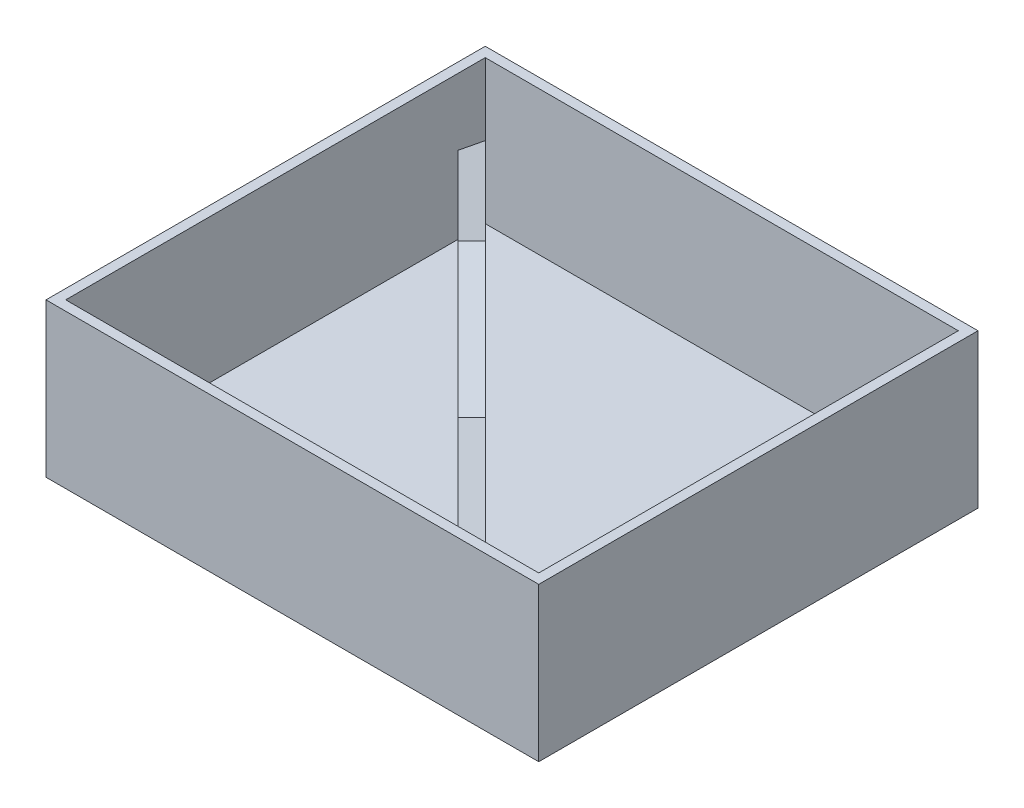
ISO-10303-21;
HEADER;
FILE_DESCRIPTION(('STEP AP214'),'2;1');
FILE_NAME('part.step','',(''),(''),'','','');
FILE_SCHEMA(('AUTOMOTIVE_DESIGN { 1 0 10303 214 1 1 1 1 }'));
ENDSEC;
DATA;
#1=APPLICATION_CONTEXT('core data for automotive mechanical design processes');
#2=APPLICATION_PROTOCOL_DEFINITION('international standard','automotive_design',2000,#1);
#3=PRODUCT_CONTEXT('',#1,'mechanical');
#4=PRODUCT('Part','Part','',(#3));
#5=PRODUCT_RELATED_PRODUCT_CATEGORY('part','',(#4));
#6=PRODUCT_DEFINITION_FORMATION('','',#4);
#7=PRODUCT_DEFINITION_CONTEXT('part definition',#1,'design');
#8=PRODUCT_DEFINITION('design','',#6,#7);
#9=PRODUCT_DEFINITION_SHAPE('','',#8);
#10=(LENGTH_UNIT() NAMED_UNIT(*) SI_UNIT(.MILLI.,.METRE.));
#11=(NAMED_UNIT(*) PLANE_ANGLE_UNIT() SI_UNIT($,.RADIAN.));
#12=(NAMED_UNIT(*) SI_UNIT($,.STERADIAN.) SOLID_ANGLE_UNIT());
#13=UNCERTAINTY_MEASURE_WITH_UNIT(LENGTH_MEASURE(1.E-05),#10,'distance_accuracy_value','');
#14=(GEOMETRIC_REPRESENTATION_CONTEXT(3) GLOBAL_UNCERTAINTY_ASSIGNED_CONTEXT((#13)) GLOBAL_UNIT_ASSIGNED_CONTEXT((#10,
#11,#12)) REPRESENTATION_CONTEXT('',''));
#15=CARTESIAN_POINT('',(0.,0.,0.));
#16=DIRECTION('',(0.,0.,1.));
#17=DIRECTION('',(1.,0.,0.));
#18=AXIS2_PLACEMENT_3D('',#15,#16,#17);
#19=CARTESIAN_POINT('',(0.,2.54,0.));
#20=DIRECTION('',(0.,1.,0.));
#21=DIRECTION('',(0.,0.,1.));
#22=AXIS2_PLACEMENT_3D('',#19,#20,#21);
#23=PLANE('',#22);
#24=DIRECTION('',(-1.,0.,0.));
#25=VECTOR('',#24,1.);
#26=CARTESIAN_POINT('',(-62.4778997860176,2.54,-61.397043942379));
#27=LINE('',#26,#25);
#28=CARTESIAN_POINT('',(62.0602912861796,2.54,-61.397043942379));
#29=VERTEX_POINT('',#28);
#30=CARTESIAN_POINT('',(-59.9378997860176,2.54,-61.3970439423789));
#31=VERTEX_POINT('',#30);
#32=EDGE_CURVE('E203',#29,#31,#27,.T.);
#33=ORIENTED_EDGE('',*,*,#32,.T.);
#34=DIRECTION('',(0.707106781186548,0.,0.707106781186547));
#35=VECTOR('',#34,1.);
#36=CARTESIAN_POINT('',(0.729572078180674,2.54,-0.729572078180674));
#37=LINE('',#36,#35);
#38=CARTESIAN_POINT('',(48.2647465351268,2.54,46.8056023787655));
#39=VERTEX_POINT('',#38);
#40=EDGE_CURVE('E245',#31,#39,#37,.T.);
#41=ORIENTED_EDGE('',*,*,#40,.T.);
#42=DIRECTION('',(1.,0.,0.));
#43=VECTOR('',#42,1.);
#44=CARTESIAN_POINT('',(-62.4778997860176,2.54,46.8056023787655));
#45=LINE('',#44,#43);
#46=CARTESIAN_POINT('',(62.0602912861796,2.54,46.8056023787655));
#47=VERTEX_POINT('',#46);
#48=EDGE_CURVE('E187',#39,#47,#45,.T.);
#49=ORIENTED_EDGE('',*,*,#48,.T.);
#50=DIRECTION('',(0.,0.,-1.));
#51=VECTOR('',#50,1.);
#52=CARTESIAN_POINT('',(62.0602912861796,2.54,-63.9370439423789));
#53=LINE('',#52,#51);
#54=EDGE_CURVE('E198',#47,#29,#53,.T.);
#55=ORIENTED_EDGE('',*,*,#54,.T.);
#56=EDGE_LOOP('',(#33,#41,#49,#55));
#57=FACE_BOUND('',#56,.T.);
#58=ADVANCED_FACE('F43',(#57),#23,.T.);
#59=CARTESIAN_POINT('',(-62.4778997860176,39.624,-63.9370439423789));
#60=DIRECTION('',(1.,0.,0.));
#61=DIRECTION('',(0.,0.,-1.));
#62=AXIS2_PLACEMENT_3D('',#59,#60,#61);
#63=PLANE('',#62);
#64=DIRECTION('',(0.,-1.,0.));
#65=VECTOR('',#64,1.);
#66=CARTESIAN_POINT('',(-62.4778997860176,39.624,-63.9370439423789));
#67=LINE('',#66,#65);
#68=CARTESIAN_POINT('',(-62.4778997860176,39.624,-63.9370439423789));
#69=VERTEX_POINT('',#68);
#70=CARTESIAN_POINT('',(-62.4778997860176,0.,-63.9370439423789));
#71=VERTEX_POINT('',#70);
#72=EDGE_CURVE('E222',#69,#71,#67,.T.);
#73=ORIENTED_EDGE('',*,*,#72,.T.);
#74=DIRECTION('',(0.,0.,1.));
#75=VECTOR('',#74,1.);
#76=CARTESIAN_POINT('',(-62.4778997860176,0.,-63.9370439423789));
#77=LINE('',#76,#75);
#78=CARTESIAN_POINT('',(-62.4778997860176,0.,49.3456023787655));
#79=VERTEX_POINT('',#78);
#80=EDGE_CURVE('E188',#71,#79,#77,.T.);
#81=ORIENTED_EDGE('',*,*,#80,.T.);
#82=DIRECTION('',(0.,-1.,0.));
#83=VECTOR('',#82,1.);
#84=CARTESIAN_POINT('',(-62.4778997860176,39.624,49.3456023787655));
#85=LINE('',#84,#83);
#86=CARTESIAN_POINT('',(-62.4778997860176,39.624,49.3456023787655));
#87=VERTEX_POINT('',#86);
#88=EDGE_CURVE('E237',#87,#79,#85,.T.);
#89=ORIENTED_EDGE('',*,*,#88,.F.);
#90=DIRECTION('',(0.,0.,1.));
#91=VECTOR('',#90,1.);
#92=CARTESIAN_POINT('',(-62.4778997860176,39.624,-63.9370439423789));
#93=LINE('',#92,#91);
#94=EDGE_CURVE('E211',#69,#87,#93,.T.);
#95=ORIENTED_EDGE('',*,*,#94,.F.);
#96=EDGE_LOOP('',(#73,#81,#89,#95));
#97=FACE_BOUND('',#96,.T.);
#98=ADVANCED_FACE('F44',(#97),#63,.F.);
#99=CARTESIAN_POINT('',(-62.4778997860176,39.624,49.3456023787655));
#100=DIRECTION('',(0.,0.,-1.));
#101=DIRECTION('',(-1.,0.,0.));
#102=AXIS2_PLACEMENT_3D('',#99,#100,#101);
#103=PLANE('',#102);
#104=DIRECTION('',(1.,0.,0.));
#105=VECTOR('',#104,1.);
#106=CARTESIAN_POINT('',(-62.4778997860176,0.,49.3456023787655));
#107=LINE('',#106,#105);
#108=CARTESIAN_POINT('',(64.6002912861796,0.,49.3456023787655));
#109=VERTEX_POINT('',#108);
#110=EDGE_CURVE('E228',#79,#109,#107,.T.);
#111=ORIENTED_EDGE('',*,*,#110,.T.);
#112=DIRECTION('',(0.,-1.,0.));
#113=VECTOR('',#112,1.);
#114=CARTESIAN_POINT('',(64.6002912861796,39.624,49.3456023787655));
#115=LINE('',#114,#113);
#116=CARTESIAN_POINT('',(64.6002912861796,39.624,49.3456023787655));
#117=VERTEX_POINT('',#116);
#118=EDGE_CURVE('E236',#117,#109,#115,.T.);
#119=ORIENTED_EDGE('',*,*,#118,.F.);
#120=DIRECTION('',(1.,0.,0.));
#121=VECTOR('',#120,1.);
#122=CARTESIAN_POINT('',(-62.4778997860176,39.624,49.3456023787655));
#123=LINE('',#122,#121);
#124=EDGE_CURVE('E217',#87,#117,#123,.T.);
#125=ORIENTED_EDGE('',*,*,#124,.F.);
#126=ORIENTED_EDGE('',*,*,#88,.T.);
#127=EDGE_LOOP('',(#111,#119,#125,#126));
#128=FACE_BOUND('',#127,.T.);
#129=ADVANCED_FACE('F285',(#128),#103,.F.);
#130=CARTESIAN_POINT('',(64.6002912861796,39.624,-63.9370439423789));
#131=DIRECTION('',(-1.,0.,0.));
#132=DIRECTION('',(0.,0.,1.));
#133=AXIS2_PLACEMENT_3D('',#130,#131,#132);
#134=PLANE('',#133);
#135=DIRECTION('',(0.,0.,-1.));
#136=VECTOR('',#135,1.);
#137=CARTESIAN_POINT('',(64.6002912861796,0.,-63.9370439423789));
#138=LINE('',#137,#136);
#139=CARTESIAN_POINT('',(64.6002912861796,0.,-63.9370439423789));
#140=VERTEX_POINT('',#139);
#141=EDGE_CURVE('E226',#109,#140,#138,.T.);
#142=ORIENTED_EDGE('',*,*,#141,.T.);
#143=DIRECTION('',(0.,-1.,0.));
#144=VECTOR('',#143,1.);
#145=CARTESIAN_POINT('',(64.6002912861796,39.624,-63.9370439423789));
#146=LINE('',#145,#144);
#147=CARTESIAN_POINT('',(64.6002912861796,39.624,-63.9370439423789));
#148=VERTEX_POINT('',#147);
#149=EDGE_CURVE('E231',#148,#140,#146,.T.);
#150=ORIENTED_EDGE('',*,*,#149,.F.);
#151=DIRECTION('',(0.,0.,-1.));
#152=VECTOR('',#151,1.);
#153=CARTESIAN_POINT('',(64.6002912861796,39.624,-63.9370439423789));
#154=LINE('',#153,#152);
#155=EDGE_CURVE('E220',#117,#148,#154,.T.);
#156=ORIENTED_EDGE('',*,*,#155,.F.);
#157=ORIENTED_EDGE('',*,*,#118,.T.);
#158=EDGE_LOOP('',(#142,#150,#156,#157));
#159=FACE_BOUND('',#158,.T.);
#160=ADVANCED_FACE('F300',(#159),#134,.F.);
#161=CARTESIAN_POINT('',(-62.4778997860176,39.624,-63.9370439423789));
#162=DIRECTION('',(0.,0.,1.));
#163=DIRECTION('',(1.,0.,0.));
#164=AXIS2_PLACEMENT_3D('',#161,#162,#163);
#165=PLANE('',#164);
#166=DIRECTION('',(-1.,0.,0.));
#167=VECTOR('',#166,1.);
#168=CARTESIAN_POINT('',(-62.4778997860176,0.,-63.9370439423789));
#169=LINE('',#168,#167);
#170=EDGE_CURVE('E219',#140,#71,#169,.T.);
#171=ORIENTED_EDGE('',*,*,#170,.T.);
#172=ORIENTED_EDGE('',*,*,#72,.F.);
#173=DIRECTION('',(-1.,0.,0.));
#174=VECTOR('',#173,1.);
#175=CARTESIAN_POINT('',(-62.4778997860176,39.624,-63.9370439423789));
#176=LINE('',#175,#174);
#177=EDGE_CURVE('E225',#148,#69,#176,.T.);
#178=ORIENTED_EDGE('',*,*,#177,.F.);
#179=ORIENTED_EDGE('',*,*,#149,.T.);
#180=EDGE_LOOP('',(#171,#172,#178,#179));
#181=FACE_BOUND('',#180,.T.);
#182=ADVANCED_FACE('F293',(#181),#165,.F.);
#183=CARTESIAN_POINT('',(0.,39.624,0.));
#184=DIRECTION('',(0.,1.,0.));
#185=DIRECTION('',(0.,0.,1.));
#186=AXIS2_PLACEMENT_3D('',#183,#184,#185);
#187=PLANE('',#186);
#188=DIRECTION('',(0.,0.,1.));
#189=VECTOR('',#188,1.);
#190=CARTESIAN_POINT('',(-59.9378997860176,39.624,-63.9370439423789));
#191=LINE('',#190,#189);
#192=CARTESIAN_POINT('',(-59.9378997860176,39.624,-61.397043942379));
#193=VERTEX_POINT('',#192);
#194=CARTESIAN_POINT('',(-59.9378997860176,39.624,46.8056023787655));
#195=VERTEX_POINT('',#194);
#196=EDGE_CURVE('E210',#193,#195,#191,.T.);
#197=ORIENTED_EDGE('',*,*,#196,.F.);
#198=DIRECTION('',(-1.,0.,0.));
#199=VECTOR('',#198,1.);
#200=CARTESIAN_POINT('',(-62.4778997860176,39.624,-61.397043942379));
#201=LINE('',#200,#199);
#202=CARTESIAN_POINT('',(62.0602912861796,39.624,-61.397043942379));
#203=VERTEX_POINT('',#202);
#204=EDGE_CURVE('E193',#203,#193,#201,.T.);
#205=ORIENTED_EDGE('',*,*,#204,.F.);
#206=DIRECTION('',(0.,0.,-1.));
#207=VECTOR('',#206,1.);
#208=CARTESIAN_POINT('',(62.0602912861796,39.624,-63.9370439423789));
#209=LINE('',#208,#207);
#210=CARTESIAN_POINT('',(62.0602912861796,39.624,46.8056023787655));
#211=VERTEX_POINT('',#210);
#212=EDGE_CURVE('E212',#211,#203,#209,.T.);
#213=ORIENTED_EDGE('',*,*,#212,.F.);
#214=DIRECTION('',(1.,0.,0.));
#215=VECTOR('',#214,1.);
#216=CARTESIAN_POINT('',(-62.4778997860176,39.624,46.8056023787655));
#217=LINE('',#216,#215);
#218=EDGE_CURVE('E209',#195,#211,#217,.T.);
#219=ORIENTED_EDGE('',*,*,#218,.F.);
#220=EDGE_LOOP('',(#197,#205,#213,#219));
#221=FACE_BOUND('',#220,.T.);
#222=ORIENTED_EDGE('',*,*,#94,.T.);
#223=ORIENTED_EDGE('',*,*,#124,.T.);
#224=ORIENTED_EDGE('',*,*,#155,.T.);
#225=ORIENTED_EDGE('',*,*,#177,.T.);
#226=EDGE_LOOP('',(#222,#223,#224,#225));
#227=FACE_BOUND('',#226,.T.);
#228=ADVANCED_FACE('F261',(#221,#227),#187,.T.);
#229=CARTESIAN_POINT('',(0.,0.,0.));
#230=DIRECTION('',(0.,1.,0.));
#231=DIRECTION('',(0.,0.,1.));
#232=AXIS2_PLACEMENT_3D('',#229,#230,#231);
#233=PLANE('',#232);
#234=ORIENTED_EDGE('',*,*,#110,.F.);
#235=ORIENTED_EDGE('',*,*,#80,.F.);
#236=ORIENTED_EDGE('',*,*,#170,.F.);
#237=ORIENTED_EDGE('',*,*,#141,.F.);
#238=EDGE_LOOP('',(#234,#235,#236,#237));
#239=FACE_BOUND('',#238,.T.);
#240=ADVANCED_FACE('F289',(#239),#233,.F.);
#241=CARTESIAN_POINT('',(-59.9378997860176,39.624,-63.9370439423789));
#242=DIRECTION('',(1.,0.,0.));
#243=DIRECTION('',(0.,0.,-1.));
#244=AXIS2_PLACEMENT_3D('',#241,#242,#243);
#245=PLANE('',#244);
#246=DIRECTION('',(0.,-0.189206076258095,-0.981937401623452));
#247=VECTOR('',#246,1.);
#248=CARTESIAN_POINT('',(-59.9378997860176,21.2739437474469,-60.4012359194636));
#249=LINE('',#248,#247);
#250=CARTESIAN_POINT('',(-59.9378997860176,21.0820649897881,-61.397043942379));
#251=VERTEX_POINT('',#250);
#252=CARTESIAN_POINT('',(-59.9378997860176,22.4445642625789,-54.3259761305135));
#253=VERTEX_POINT('',#252);
#254=EDGE_CURVE('E146',#251,#253,#249,.F.);
#255=ORIENTED_EDGE('',*,*,#254,.F.);
#256=DIRECTION('',(0.,-1.,0.));
#257=VECTOR('',#256,1.);
#258=CARTESIAN_POINT('',(-59.9378997860176,39.624,-61.397043942379));
#259=LINE('',#258,#257);
#260=EDGE_CURVE('E195',#193,#251,#259,.T.);
#261=ORIENTED_EDGE('',*,*,#260,.F.);
#262=ORIENTED_EDGE('',*,*,#196,.T.);
#263=DIRECTION('',(0.,-1.,0.));
#264=VECTOR('',#263,1.);
#265=CARTESIAN_POINT('',(-59.9378997860176,39.624,46.8056023787655));
#266=LINE('',#265,#264);
#267=CARTESIAN_POINT('',(-59.9378997860176,2.54,46.8056023787655));
#268=VERTEX_POINT('',#267);
#269=EDGE_CURVE('E190',#195,#268,#266,.T.);
#270=ORIENTED_EDGE('',*,*,#269,.T.);
#271=DIRECTION('',(0.,0.,1.));
#272=VECTOR('',#271,1.);
#273=CARTESIAN_POINT('',(-59.9378997860176,2.54,-63.9370439423789));
#274=LINE('',#273,#272);
#275=CARTESIAN_POINT('',(-59.9378997860176,2.54,-54.3259761305135));
#276=VERTEX_POINT('',#275);
#277=EDGE_CURVE('E183',#276,#268,#274,.T.);
#278=ORIENTED_EDGE('',*,*,#277,.F.);
#279=DIRECTION('',(0.,-1.,0.));
#280=VECTOR('',#279,1.);
#281=CARTESIAN_POINT('',(-59.9378997860176,39.624,-54.3259761305135));
#282=LINE('',#281,#280);
#283=EDGE_CURVE('E181',#253,#276,#282,.T.);
#284=ORIENTED_EDGE('',*,*,#283,.F.);
#285=EDGE_LOOP('',(#255,#261,#262,#270,#278,#284));
#286=FACE_BOUND('',#285,.T.);
#287=ADVANCED_FACE('F251',(#286),#245,.T.);
#288=CARTESIAN_POINT('',(-62.4778997860176,39.624,46.8056023787655));
#289=DIRECTION('',(0.,0.,-1.));
#290=DIRECTION('',(-1.,0.,0.));
#291=AXIS2_PLACEMENT_3D('',#288,#289,#290);
#292=PLANE('',#291);
#293=DIRECTION('',(0.,1.,0.));
#294=VECTOR('',#293,1.);
#295=CARTESIAN_POINT('',(41.1936787232614,39.624,46.8056023787655));
#296=LINE('',#295,#294);
#297=CARTESIAN_POINT('',(41.1936787232614,2.54,46.8056023787655));
#298=VERTEX_POINT('',#297);
#299=CARTESIAN_POINT('',(41.1936787232614,32.8485755279955,46.8056023787655));
#300=VERTEX_POINT('',#299);
#301=EDGE_CURVE('E177',#298,#300,#296,.T.);
#302=ORIENTED_EDGE('',*,*,#301,.F.);
#303=EDGE_CURVE('E196',#268,#298,#45,.T.);
#304=ORIENTED_EDGE('',*,*,#303,.F.);
#305=ORIENTED_EDGE('',*,*,#269,.F.);
#306=ORIENTED_EDGE('',*,*,#218,.T.);
#307=DIRECTION('',(0.,-1.,0.));
#308=VECTOR('',#307,1.);
#309=CARTESIAN_POINT('',(62.0602912861796,39.624,46.8056023787655));
#310=LINE('',#309,#308);
#311=EDGE_CURVE('E192',#211,#47,#310,.T.);
#312=ORIENTED_EDGE('',*,*,#311,.T.);
#313=ORIENTED_EDGE('',*,*,#48,.F.);
#314=DIRECTION('',(0.,1.,0.));
#315=VECTOR('',#314,1.);
#316=CARTESIAN_POINT('',(48.2647465351269,39.624,46.8056023787655));
#317=LINE('',#316,#315);
#318=CARTESIAN_POINT('',(48.2647465351269,33.5358900537595,46.8056023787655));
#319=VERTEX_POINT('',#318);
#320=EDGE_CURVE('E59',#39,#319,#317,.T.);
#321=ORIENTED_EDGE('',*,*,#320,.T.);
#322=DIRECTION('',(-0.995309200473239,-0.0967450022136603,0.));
#323=VECTOR('',#322,1.);
#324=CARTESIAN_POINT('',(-60.855162060558,22.9293310129866,46.8056023787655));
#325=LINE('',#324,#323);
#326=EDGE_CURVE('E11',#300,#319,#325,.F.);
#327=ORIENTED_EDGE('',*,*,#326,.F.);
#328=EDGE_LOOP('',(#302,#304,#305,#306,#312,#313,#321,#327));
#329=FACE_BOUND('',#328,.T.);
#330=ADVANCED_FACE('F249',(#329),#292,.T.);
#331=CARTESIAN_POINT('',(62.0602912861796,39.624,-63.9370439423789));
#332=DIRECTION('',(-1.,0.,0.));
#333=DIRECTION('',(0.,0.,1.));
#334=AXIS2_PLACEMENT_3D('',#331,#332,#333);
#335=PLANE('',#334);
#336=ORIENTED_EDGE('',*,*,#54,.F.);
#337=ORIENTED_EDGE('',*,*,#311,.F.);
#338=ORIENTED_EDGE('',*,*,#212,.T.);
#339=DIRECTION('',(0.,-1.,0.));
#340=VECTOR('',#339,1.);
#341=CARTESIAN_POINT('',(62.0602912861796,39.624,-61.397043942379));
#342=LINE('',#341,#340);
#343=EDGE_CURVE('E66',#203,#29,#342,.T.);
#344=ORIENTED_EDGE('',*,*,#343,.T.);
#345=EDGE_LOOP('',(#336,#337,#338,#344));
#346=FACE_BOUND('',#345,.T.);
#347=ADVANCED_FACE('F266',(#346),#335,.T.);
#348=CARTESIAN_POINT('',(-62.4778997860176,39.624,-61.397043942379));
#349=DIRECTION('',(0.,0.,1.));
#350=DIRECTION('',(1.,0.,0.));
#351=AXIS2_PLACEMENT_3D('',#348,#349,#350);
#352=PLANE('',#351);
#353=ORIENTED_EDGE('',*,*,#32,.F.);
#354=ORIENTED_EDGE('',*,*,#343,.F.);
#355=ORIENTED_EDGE('',*,*,#204,.T.);
#356=ORIENTED_EDGE('',*,*,#260,.T.);
#357=DIRECTION('',(0.,-1.,0.));
#358=VECTOR('',#357,1.);
#359=CARTESIAN_POINT('',(-59.9378997860176,39.624,-61.397043942379));
#360=LINE('',#359,#358);
#361=EDGE_CURVE('E174',#251,#31,#360,.T.);
#362=ORIENTED_EDGE('',*,*,#361,.T.);
#363=EDGE_LOOP('',(#353,#354,#355,#356,#362));
#364=FACE_BOUND('',#363,.T.);
#365=ADVANCED_FACE('F269',(#364),#352,.T.);
#366=DIRECTION('',(0.707106781186548,0.,0.707106781186547));
#367=VECTOR('',#366,1.);
#368=CARTESIAN_POINT('',(-2.80596182775206,2.54,2.80596182775207));
#369=LINE('',#368,#367);
#370=EDGE_CURVE('E51',#276,#298,#369,.T.);
#371=ORIENTED_EDGE('',*,*,#370,.F.);
#372=ORIENTED_EDGE('',*,*,#277,.T.);
#373=ORIENTED_EDGE('',*,*,#303,.T.);
#374=EDGE_LOOP('',(#371,#372,#373));
#375=FACE_BOUND('',#374,.T.);
#376=ADVANCED_FACE('F255',(#375),#23,.T.);
#377=CARTESIAN_POINT('',(6.19267906962794,25.357,4.73353491326659));
#378=DIRECTION('',(0.0962954087319371,-0.990683798451503,0.0962954087319371));
#379=DIRECTION('',(0.700519231896705,0.136182273022966,0.700519231896705));
#380=AXIS2_PLACEMENT_3D('',#377,#378,#379);
#381=PLANE('',#380);
#382=DIRECTION('',(0.700519231896705,0.136182273022966,0.700519231896705));
#383=VECTOR('',#382,1.);
#384=CARTESIAN_POINT('',(2.65714516369521,25.357,8.26906881919933));
#385=LINE('',#384,#383);
#386=CARTESIAN_POINT('',(2.6571451636952,25.357,8.26906881919933));
#387=VERTEX_POINT('',#386);
#388=EDGE_CURVE('E164',#387,#300,#385,.T.);
#389=ORIENTED_EDGE('',*,*,#388,.T.);
#390=ORIENTED_EDGE('',*,*,#326,.T.);
#391=DIRECTION('',(0.700519231896705,0.136182273022966,0.700519231896705));
#392=VECTOR('',#391,1.);
#393=CARTESIAN_POINT('',(6.19267906962794,25.357,4.73353491326659));
#394=LINE('',#393,#392);
#395=CARTESIAN_POINT('',(6.19267906962794,25.357,4.73353491326659));
#396=VERTEX_POINT('',#395);
#397=EDGE_CURVE('E167',#396,#319,#394,.T.);
#398=ORIENTED_EDGE('',*,*,#397,.F.);
#399=DIRECTION('',(-0.707106781186547,0.,0.707106781186548));
#400=VECTOR('',#399,1.);
#401=CARTESIAN_POINT('',(6.19267906962794,25.357,4.73353491326659));
#402=LINE('',#401,#400);
#403=EDGE_CURVE('E159',#396,#387,#402,.T.);
#404=ORIENTED_EDGE('',*,*,#403,.T.);
#405=EDGE_LOOP('',(#389,#390,#398,#404));
#406=FACE_BOUND('',#405,.T.);
#407=ADVANCED_FACE('F280',(#406),#381,.F.);
#408=CARTESIAN_POINT('',(-23.4746930418348,35.134,-24.9338371981962));
#409=DIRECTION('',(-0.160477384938449,-0.973906575522844,-0.160477384938449));
#410=DIRECTION('',(0.688655943794372,-0.226949294234123,0.688655943794372));
#411=AXIS2_PLACEMENT_3D('',#408,#409,#410);
#412=PLANE('',#411);
#413=ORIENTED_EDGE('',*,*,#403,.F.);
#414=DIRECTION('',(0.688655943794372,-0.226949294234123,0.688655943794372));
#415=VECTOR('',#414,1.);
#416=CARTESIAN_POINT('',(-23.4746930418348,35.134,-24.9338371981962));
#417=LINE('',#416,#415);
#418=CARTESIAN_POINT('',(-23.4746930418348,35.134,-24.9338371981962));
#419=VERTEX_POINT('',#418);
#420=EDGE_CURVE('E157',#419,#396,#417,.T.);
#421=ORIENTED_EDGE('',*,*,#420,.F.);
#422=DIRECTION('',(-0.707106781186547,0.,0.707106781186548));
#423=VECTOR('',#422,1.);
#424=CARTESIAN_POINT('',(-23.4746930418348,35.134,-24.9338371981962));
#425=LINE('',#424,#423);
#426=CARTESIAN_POINT('',(-27.0102269477676,35.134,-21.3983032922634));
#427=VERTEX_POINT('',#426);
#428=EDGE_CURVE('E147',#419,#427,#425,.T.);
#429=ORIENTED_EDGE('',*,*,#428,.T.);
#430=DIRECTION('',(0.688655943794372,-0.226949294234123,0.688655943794372));
#431=VECTOR('',#430,1.);
#432=CARTESIAN_POINT('',(-27.0102269477676,35.134,-21.3983032922635));
#433=LINE('',#432,#431);
#434=EDGE_CURVE('E154',#427,#387,#433,.T.);
#435=ORIENTED_EDGE('',*,*,#434,.T.);
#436=EDGE_LOOP('',(#413,#421,#429,#435));
#437=FACE_BOUND('',#436,.T.);
#438=ADVANCED_FACE('F160',(#437),#412,.F.);
#439=CARTESIAN_POINT('',(-59.9380684272816,21.082,-61.3972125836429));
#440=DIRECTION('',(0.185907687388523,-0.96481949790606,0.185907687388523));
#441=DIRECTION('',(0.682230409590376,0.262913172854267,0.682230409590375));
#442=AXIS2_PLACEMENT_3D('',#439,#440,#441);
#443=PLANE('',#442);
#444=DIRECTION('',(0.682230409590376,0.262913172854267,0.682230409590375));
#445=VECTOR('',#444,1.);
#446=CARTESIAN_POINT('',(-59.9380684272816,21.082,-61.3972125836429));
#447=LINE('',#446,#445);
#448=EDGE_CURVE('E170',#251,#419,#447,.T.);
#449=ORIENTED_EDGE('',*,*,#448,.F.);
#450=ORIENTED_EDGE('',*,*,#254,.T.);
#451=DIRECTION('',(0.682230409590376,0.262913172854267,0.682230409590375));
#452=VECTOR('',#451,1.);
#453=CARTESIAN_POINT('',(-63.4736023332143,21.082,-57.8616786777101));
#454=LINE('',#453,#452);
#455=EDGE_CURVE('E145',#253,#427,#454,.T.);
#456=ORIENTED_EDGE('',*,*,#455,.T.);
#457=ORIENTED_EDGE('',*,*,#428,.F.);
#458=EDGE_LOOP('',(#449,#450,#456,#457));
#459=FACE_BOUND('',#458,.T.);
#460=ADVANCED_FACE('F143',(#459),#443,.F.);
#461=CARTESIAN_POINT('',(3.61232857954962,28.0443994247742,9.22425223505375));
#462=DIRECTION('',(-0.707106781186547,0.,0.707106781186548));
#463=DIRECTION('',(0.707106781186548,0.,0.707106781186547));
#464=AXIS2_PLACEMENT_3D('',#461,#462,#463);
#465=PLANE('',#464);
#466=ORIENTED_EDGE('',*,*,#455,.F.);
#467=ORIENTED_EDGE('',*,*,#283,.T.);
#468=ORIENTED_EDGE('',*,*,#370,.T.);
#469=ORIENTED_EDGE('',*,*,#301,.T.);
#470=ORIENTED_EDGE('',*,*,#388,.F.);
#471=ORIENTED_EDGE('',*,*,#434,.F.);
#472=EDGE_LOOP('',(#466,#467,#468,#469,#470,#471));
#473=FACE_BOUND('',#472,.T.);
#474=ADVANCED_FACE('F161',(#473),#465,.T.);
#475=CARTESIAN_POINT('',(7.14786248548236,28.0443994247742,5.68871832912101));
#476=DIRECTION('',(-0.707106781186547,0.,0.707106781186548));
#477=DIRECTION('',(0.707106781186548,0.,0.707106781186547));
#478=AXIS2_PLACEMENT_3D('',#475,#476,#477);
#479=PLANE('',#478);
#480=ORIENTED_EDGE('',*,*,#320,.F.);
#481=ORIENTED_EDGE('',*,*,#40,.F.);
#482=ORIENTED_EDGE('',*,*,#361,.F.);
#483=ORIENTED_EDGE('',*,*,#448,.T.);
#484=ORIENTED_EDGE('',*,*,#420,.T.);
#485=ORIENTED_EDGE('',*,*,#397,.T.);
#486=EDGE_LOOP('',(#480,#481,#482,#483,#484,#485));
#487=FACE_BOUND('',#486,.T.);
#488=ADVANCED_FACE('F267',(#487),#479,.F.);
#489=CLOSED_SHELL('',(#58,#98,#129,#160,#182,#228,#240,#287,#330,#347,#365,#376,#407,#438,#460,
#474,#488));
#490=MANIFOLD_SOLID_BREP('B2',#489);
#491=ADVANCED_BREP_SHAPE_REPRESENTATION('',(#18,#490),#14);
#492=SHAPE_DEFINITION_REPRESENTATION(#9,#491);
ENDSEC;
END-ISO-10303-21;
